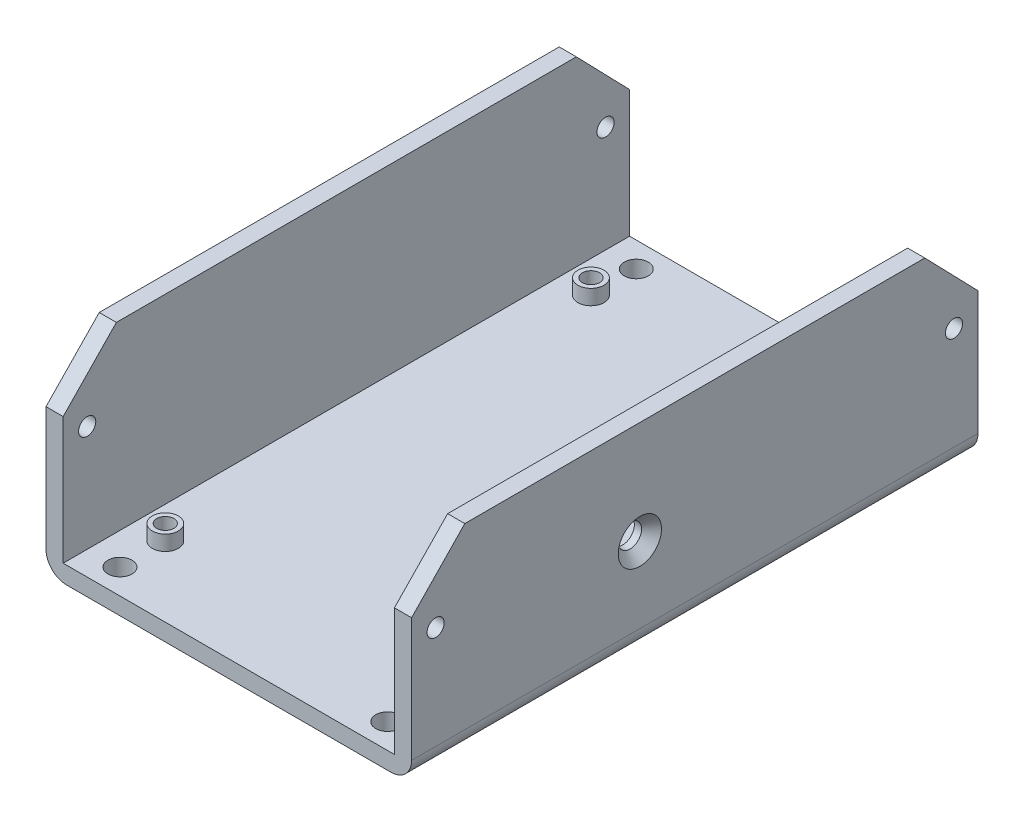
ISO-10303-21;
HEADER;
FILE_DESCRIPTION(('STEP AP214'),'2;1');
FILE_NAME('part.step','',(''),(''),'','','');
FILE_SCHEMA(('AUTOMOTIVE_DESIGN { 1 0 10303 214 1 1 1 1 }'));
ENDSEC;
DATA;
#1=APPLICATION_CONTEXT('core data for automotive mechanical design processes');
#2=APPLICATION_PROTOCOL_DEFINITION('international standard','automotive_design',2000,#1);
#3=PRODUCT_CONTEXT('',#1,'mechanical');
#4=PRODUCT('Part','Part','',(#3));
#5=PRODUCT_RELATED_PRODUCT_CATEGORY('part','',(#4));
#6=PRODUCT_DEFINITION_FORMATION('','',#4);
#7=PRODUCT_DEFINITION_CONTEXT('part definition',#1,'design');
#8=PRODUCT_DEFINITION('design','',#6,#7);
#9=PRODUCT_DEFINITION_SHAPE('','',#8);
#10=(LENGTH_UNIT() NAMED_UNIT(*) SI_UNIT(.MILLI.,.METRE.));
#11=(NAMED_UNIT(*) PLANE_ANGLE_UNIT() SI_UNIT($,.RADIAN.));
#12=(NAMED_UNIT(*) SI_UNIT($,.STERADIAN.) SOLID_ANGLE_UNIT());
#13=UNCERTAINTY_MEASURE_WITH_UNIT(LENGTH_MEASURE(1.E-05),#10,'distance_accuracy_value','');
#14=(GEOMETRIC_REPRESENTATION_CONTEXT(3) GLOBAL_UNCERTAINTY_ASSIGNED_CONTEXT((#13)) GLOBAL_UNIT_ASSIGNED_CONTEXT((#10,
#11,#12)) REPRESENTATION_CONTEXT('',''));
#15=CARTESIAN_POINT('',(0.,0.,0.));
#16=DIRECTION('',(0.,0.,1.));
#17=DIRECTION('',(1.,0.,0.));
#18=AXIS2_PLACEMENT_3D('',#15,#16,#17);
#19=CARTESIAN_POINT('',(-24.125,2.49999999999999,41.25));
#20=DIRECTION('',(-1.,0.,0.));
#21=DIRECTION('',(0.,0.,1.));
#22=AXIS2_PLACEMENT_3D('',#19,#20,#21);
#23=PLANE('',#22);
#24=CARTESIAN_POINT('',(-24.125,18.,-37.75));
#25=DIRECTION('',(-1.,0.,0.));
#26=DIRECTION('',(0.,0.,1.));
#27=AXIS2_PLACEMENT_3D('',#24,#25,#26);
#28=CIRCLE('',#27,1.24999999999999);
#29=CARTESIAN_POINT('',(-24.125,18.,-36.5));
#30=VERTEX_POINT('',#29);
#31=EDGE_CURVE('E362',#30,#30,#28,.F.);
#32=ORIENTED_EDGE('',*,*,#31,.F.);
#33=EDGE_LOOP('',(#32));
#34=FACE_BOUND('',#33,.T.);
#35=DIRECTION('',(0.,1.,0.));
#36=VECTOR('',#35,1.);
#37=CARTESIAN_POINT('',(-24.125,2.49999999999999,-41.25));
#38=LINE('',#37,#36);
#39=CARTESIAN_POINT('',(-24.125,2.49999999999999,-41.25));
#40=VERTEX_POINT('',#39);
#41=CARTESIAN_POINT('',(-24.125,21.,-41.25));
#42=VERTEX_POINT('',#41);
#43=EDGE_CURVE('E257',#40,#42,#38,.T.);
#44=ORIENTED_EDGE('',*,*,#43,.T.);
#45=DIRECTION('',(0.,0.718240222789173,0.695795215827013));
#46=VECTOR('',#45,1.);
#47=CARTESIAN_POINT('',(-24.125,52.6856423173804,-10.5545340050377));
#48=LINE('',#47,#46);
#49=CARTESIAN_POINT('',(-24.125,29.,-33.5));
#50=VERTEX_POINT('',#49);
#51=EDGE_CURVE('E325',#42,#50,#48,.T.);
#52=ORIENTED_EDGE('',*,*,#51,.T.);
#53=DIRECTION('',(0.,0.,-1.));
#54=VECTOR('',#53,1.);
#55=CARTESIAN_POINT('',(-24.125,29.,41.25));
#56=LINE('',#55,#54);
#57=CARTESIAN_POINT('',(-24.125,29.,33.5));
#58=VERTEX_POINT('',#57);
#59=EDGE_CURVE('E267',#58,#50,#56,.T.);
#60=ORIENTED_EDGE('',*,*,#59,.F.);
#61=DIRECTION('',(0.,-0.718240222789173,0.695795215827013));
#62=VECTOR('',#61,1.);
#63=CARTESIAN_POINT('',(-24.125,11.4564231738035,50.4953400503778));
#64=LINE('',#63,#62);
#65=CARTESIAN_POINT('',(-24.125,21.,41.25));
#66=VERTEX_POINT('',#65);
#67=EDGE_CURVE('E322',#58,#66,#64,.T.);
#68=ORIENTED_EDGE('',*,*,#67,.T.);
#69=DIRECTION('',(0.,1.,0.));
#70=VECTOR('',#69,1.);
#71=CARTESIAN_POINT('',(-24.125,2.49999999999999,41.25));
#72=LINE('',#71,#70);
#73=CARTESIAN_POINT('',(-24.125,2.49999999999999,41.25));
#74=VERTEX_POINT('',#73);
#75=EDGE_CURVE('E266',#74,#66,#72,.T.);
#76=ORIENTED_EDGE('',*,*,#75,.F.);
#77=DIRECTION('',(0.,0.,-1.));
#78=VECTOR('',#77,1.);
#79=CARTESIAN_POINT('',(-24.125,2.49999999999999,41.25));
#80=LINE('',#79,#78);
#81=EDGE_CURVE('E251',#74,#40,#80,.T.);
#82=ORIENTED_EDGE('',*,*,#81,.T.);
#83=EDGE_LOOP('',(#44,#52,#60,#68,#76,#82));
#84=FACE_BOUND('',#83,.T.);
#85=CARTESIAN_POINT('',(-24.125,18.,37.75));
#86=DIRECTION('',(-1.,0.,0.));
#87=DIRECTION('',(0.,0.,1.));
#88=AXIS2_PLACEMENT_3D('',#85,#86,#87);
#89=CIRCLE('',#88,1.24999999999999);
#90=CARTESIAN_POINT('',(-24.125,18.,39.));
#91=VERTEX_POINT('',#90);
#92=EDGE_CURVE('E356',#91,#91,#89,.F.);
#93=ORIENTED_EDGE('',*,*,#92,.F.);
#94=EDGE_LOOP('',(#93));
#95=FACE_BOUND('',#94,.T.);
#96=ADVANCED_FACE('F49',(#34,#84,#95),#23,.F.);
#97=CARTESIAN_POINT('',(24.125,29.,41.25));
#98=DIRECTION('',(1.,0.,0.));
#99=DIRECTION('',(0.,0.,-1.));
#100=AXIS2_PLACEMENT_3D('',#97,#98,#99);
#101=PLANE('',#100);
#102=CARTESIAN_POINT('',(24.125,14.,8.));
#103=DIRECTION('',(1.,0.,0.));
#104=DIRECTION('',(0.,0.,-1.));
#105=AXIS2_PLACEMENT_3D('',#102,#103,#104);
#106=CIRCLE('',#105,1.69999999999999);
#107=CARTESIAN_POINT('',(24.125,14.,6.30000000000001));
#108=VERTEX_POINT('',#107);
#109=EDGE_CURVE('E53',#108,#108,#106,.T.);
#110=ORIENTED_EDGE('',*,*,#109,.T.);
#111=EDGE_LOOP('',(#110));
#112=FACE_BOUND('',#111,.T.);
#113=DIRECTION('',(0.,0.,-1.));
#114=VECTOR('',#113,1.);
#115=CARTESIAN_POINT('',(24.125,29.,41.25));
#116=LINE('',#115,#114);
#117=CARTESIAN_POINT('',(24.125,29.,33.5));
#118=VERTEX_POINT('',#117);
#119=CARTESIAN_POINT('',(24.125,29.,-33.5));
#120=VERTEX_POINT('',#119);
#121=EDGE_CURVE('E179',#118,#120,#116,.T.);
#122=ORIENTED_EDGE('',*,*,#121,.T.);
#123=DIRECTION('',(0.,-0.718240222789173,-0.695795215827013));
#124=VECTOR('',#123,1.);
#125=CARTESIAN_POINT('',(24.125,66.3561712846348,2.68879093198998));
#126=LINE('',#125,#124);
#127=CARTESIAN_POINT('',(24.125,21.,-41.25));
#128=VERTEX_POINT('',#127);
#129=EDGE_CURVE('E156',#120,#128,#126,.T.);
#130=ORIENTED_EDGE('',*,*,#129,.T.);
#131=DIRECTION('',(0.,-1.,0.));
#132=VECTOR('',#131,1.);
#133=CARTESIAN_POINT('',(24.125,29.,-41.25));
#134=LINE('',#133,#132);
#135=CARTESIAN_POINT('',(24.125,2.49999999999999,-41.25));
#136=VERTEX_POINT('',#135);
#137=EDGE_CURVE('E258',#128,#136,#134,.T.);
#138=ORIENTED_EDGE('',*,*,#137,.T.);
#139=DIRECTION('',(0.,0.,-1.));
#140=VECTOR('',#139,1.);
#141=CARTESIAN_POINT('',(24.125,2.49999999999999,41.25));
#142=LINE('',#141,#140);
#143=CARTESIAN_POINT('',(24.125,2.49999999999999,41.25));
#144=VERTEX_POINT('',#143);
#145=EDGE_CURVE('E183',#144,#136,#142,.T.);
#146=ORIENTED_EDGE('',*,*,#145,.F.);
#147=DIRECTION('',(0.,-1.,0.));
#148=VECTOR('',#147,1.);
#149=CARTESIAN_POINT('',(24.125,29.,41.25));
#150=LINE('',#149,#148);
#151=CARTESIAN_POINT('',(24.125,21.,41.25));
#152=VERTEX_POINT('',#151);
#153=EDGE_CURVE('E287',#152,#144,#150,.T.);
#154=ORIENTED_EDGE('',*,*,#153,.F.);
#155=DIRECTION('',(0.,0.718240222789173,-0.695795215827013));
#156=VECTOR('',#155,1.);
#157=CARTESIAN_POINT('',(24.125,25.1269521410579,37.2520151133501));
#158=LINE('',#157,#156);
#159=EDGE_CURVE('E65',#152,#118,#158,.T.);
#160=ORIENTED_EDGE('',*,*,#159,.T.);
#161=EDGE_LOOP('',(#122,#130,#138,#146,#154,#160));
#162=FACE_BOUND('',#161,.T.);
#163=CARTESIAN_POINT('',(24.125,18.,37.75));
#164=DIRECTION('',(1.,0.,0.));
#165=DIRECTION('',(0.,0.,-1.));
#166=AXIS2_PLACEMENT_3D('',#163,#164,#165);
#167=CIRCLE('',#166,1.24999999999999);
#168=CARTESIAN_POINT('',(24.125,18.,36.5));
#169=VERTEX_POINT('',#168);
#170=EDGE_CURVE('E342',#169,#169,#167,.F.);
#171=ORIENTED_EDGE('',*,*,#170,.F.);
#172=EDGE_LOOP('',(#171));
#173=FACE_BOUND('',#172,.T.);
#174=CARTESIAN_POINT('',(24.125,18.,-37.75));
#175=DIRECTION('',(1.,0.,0.));
#176=DIRECTION('',(0.,0.,-1.));
#177=AXIS2_PLACEMENT_3D('',#174,#175,#176);
#178=CIRCLE('',#177,1.24999999999999);
#179=CARTESIAN_POINT('',(24.125,18.,-39.));
#180=VERTEX_POINT('',#179);
#181=EDGE_CURVE('E350',#180,#180,#178,.F.);
#182=ORIENTED_EDGE('',*,*,#181,.F.);
#183=EDGE_LOOP('',(#182));
#184=FACE_BOUND('',#183,.T.);
#185=ADVANCED_FACE('F300',(#112,#162,#173,#184),#101,.F.);
#186=CARTESIAN_POINT('',(-24.125,29.,41.25));
#187=DIRECTION('',(0.,-1.,0.));
#188=DIRECTION('',(1.,0.,0.));
#189=AXIS2_PLACEMENT_3D('',#186,#187,#188);
#190=PLANE('',#189);
#191=ORIENTED_EDGE('',*,*,#59,.T.);
#192=DIRECTION('',(1.,0.,0.));
#193=VECTOR('',#192,1.);
#194=CARTESIAN_POINT('',(-26.625,29.,-33.5));
#195=LINE('',#194,#193);
#196=CARTESIAN_POINT('',(-26.625,29.,-33.5));
#197=VERTEX_POINT('',#196);
#198=EDGE_CURVE('E161',#197,#50,#195,.T.);
#199=ORIENTED_EDGE('',*,*,#198,.F.);
#200=DIRECTION('',(0.,0.,-1.));
#201=VECTOR('',#200,1.);
#202=CARTESIAN_POINT('',(-26.625,29.,41.25));
#203=LINE('',#202,#201);
#204=CARTESIAN_POINT('',(-26.625,29.,33.5));
#205=VERTEX_POINT('',#204);
#206=EDGE_CURVE('E195',#205,#197,#203,.T.);
#207=ORIENTED_EDGE('',*,*,#206,.F.);
#208=DIRECTION('',(1.,0.,0.));
#209=VECTOR('',#208,1.);
#210=CARTESIAN_POINT('',(-26.625,29.,33.5));
#211=LINE('',#210,#209);
#212=EDGE_CURVE('E173',#205,#58,#211,.T.);
#213=ORIENTED_EDGE('',*,*,#212,.T.);
#214=EDGE_LOOP('',(#191,#199,#207,#213));
#215=FACE_BOUND('',#214,.T.);
#216=ADVANCED_FACE('F51',(#215),#190,.F.);
#217=CARTESIAN_POINT('',(-26.625,29.,41.25));
#218=DIRECTION('',(1.,0.,0.));
#219=DIRECTION('',(0.,1.,0.));
#220=AXIS2_PLACEMENT_3D('',#217,#218,#219);
#221=PLANE('',#220);
#222=CARTESIAN_POINT('',(-26.625,18.,-37.75));
#223=DIRECTION('',(-1.,0.,0.));
#224=DIRECTION('',(0.,0.,1.));
#225=AXIS2_PLACEMENT_3D('',#222,#223,#224);
#226=CIRCLE('',#225,1.24999999999999);
#227=CARTESIAN_POINT('',(-26.625,18.,-36.5));
#228=VERTEX_POINT('',#227);
#229=EDGE_CURVE('E365',#228,#228,#226,.T.);
#230=ORIENTED_EDGE('',*,*,#229,.F.);
#231=EDGE_LOOP('',(#230));
#232=FACE_BOUND('',#231,.T.);
#233=CARTESIAN_POINT('',(-26.625,18.,37.75));
#234=DIRECTION('',(-1.,0.,0.));
#235=DIRECTION('',(0.,0.,1.));
#236=AXIS2_PLACEMENT_3D('',#233,#234,#235);
#237=CIRCLE('',#236,1.24999999999999);
#238=CARTESIAN_POINT('',(-26.625,18.,39.));
#239=VERTEX_POINT('',#238);
#240=EDGE_CURVE('E359',#239,#239,#237,.T.);
#241=ORIENTED_EDGE('',*,*,#240,.F.);
#242=EDGE_LOOP('',(#241));
#243=FACE_BOUND('',#242,.T.);
#244=ORIENTED_EDGE('',*,*,#206,.T.);
#245=DIRECTION('',(0.,-0.718240222789173,-0.695795215827013));
#246=VECTOR('',#245,1.);
#247=CARTESIAN_POINT('',(-26.625,29.,-33.5));
#248=LINE('',#247,#246);
#249=CARTESIAN_POINT('',(-26.625,21.,-41.25));
#250=VERTEX_POINT('',#249);
#251=EDGE_CURVE('E162',#197,#250,#248,.T.);
#252=ORIENTED_EDGE('',*,*,#251,.T.);
#253=DIRECTION('',(0.,-1.,0.));
#254=VECTOR('',#253,1.);
#255=CARTESIAN_POINT('',(-26.625,29.,-41.25));
#256=LINE('',#255,#254);
#257=CARTESIAN_POINT('',(-26.625,3.,-41.25));
#258=VERTEX_POINT('',#257);
#259=EDGE_CURVE('E291',#250,#258,#256,.T.);
#260=ORIENTED_EDGE('',*,*,#259,.T.);
#261=DIRECTION('',(0.,0.,-1.));
#262=VECTOR('',#261,1.);
#263=CARTESIAN_POINT('',(-26.625,3.,41.25));
#264=LINE('',#263,#262);
#265=CARTESIAN_POINT('',(-26.625,3.,41.25));
#266=VERTEX_POINT('',#265);
#267=EDGE_CURVE('E192',#266,#258,#264,.T.);
#268=ORIENTED_EDGE('',*,*,#267,.F.);
#269=DIRECTION('',(0.,-1.,0.));
#270=VECTOR('',#269,1.);
#271=CARTESIAN_POINT('',(-26.625,29.,41.25));
#272=LINE('',#271,#270);
#273=CARTESIAN_POINT('',(-26.625,21.,41.25));
#274=VERTEX_POINT('',#273);
#275=EDGE_CURVE('E273',#274,#266,#272,.T.);
#276=ORIENTED_EDGE('',*,*,#275,.F.);
#277=DIRECTION('',(0.,0.718240222789173,-0.695795215827013));
#278=VECTOR('',#277,1.);
#279=CARTESIAN_POINT('',(-26.625,21.,41.25));
#280=LINE('',#279,#278);
#281=EDGE_CURVE('E73',#274,#205,#280,.T.);
#282=ORIENTED_EDGE('',*,*,#281,.T.);
#283=EDGE_LOOP('',(#244,#252,#260,#268,#276,#282));
#284=FACE_BOUND('',#283,.T.);
#285=ADVANCED_FACE('F462',(#232,#243,#284),#221,.F.);
#286=CARTESIAN_POINT('',(-23.625,3.,41.25));
#287=DIRECTION('',(0.,0.,-1.));
#288=DIRECTION('',(-1.,0.,0.));
#289=AXIS2_PLACEMENT_3D('',#286,#287,#288);
#290=CYLINDRICAL_SURFACE('',#289,3.);
#291=CARTESIAN_POINT('',(-23.625,3.,-41.25));
#292=DIRECTION('',(0.,0.,1.));
#293=DIRECTION('',(1.,0.,0.));
#294=AXIS2_PLACEMENT_3D('',#291,#292,#293);
#295=CIRCLE('',#294,3.);
#296=CARTESIAN_POINT('',(-23.625,0.,-41.25));
#297=VERTEX_POINT('',#296);
#298=EDGE_CURVE('E293',#258,#297,#295,.T.);
#299=ORIENTED_EDGE('',*,*,#298,.T.);
#300=DIRECTION('',(0.,0.,-1.));
#301=VECTOR('',#300,1.);
#302=CARTESIAN_POINT('',(-23.625,0.,41.25));
#303=LINE('',#302,#301);
#304=CARTESIAN_POINT('',(-23.625,0.,41.25));
#305=VERTEX_POINT('',#304);
#306=EDGE_CURVE('E189',#305,#297,#303,.T.);
#307=ORIENTED_EDGE('',*,*,#306,.F.);
#308=CARTESIAN_POINT('',(-23.625,3.,41.25));
#309=DIRECTION('',(0.,0.,1.));
#310=DIRECTION('',(1.,0.,0.));
#311=AXIS2_PLACEMENT_3D('',#308,#309,#310);
#312=CIRCLE('',#311,3.);
#313=EDGE_CURVE('E275',#266,#305,#312,.T.);
#314=ORIENTED_EDGE('',*,*,#313,.F.);
#315=ORIENTED_EDGE('',*,*,#267,.T.);
#316=EDGE_LOOP('',(#299,#307,#314,#315));
#317=FACE_BOUND('',#316,.T.);
#318=ADVANCED_FACE('F459',(#317),#290,.T.);
#319=CARTESIAN_POINT('',(-23.625,0.,41.25));
#320=DIRECTION('',(0.,1.,0.));
#321=DIRECTION('',(-1.,0.,0.));
#322=AXIS2_PLACEMENT_3D('',#319,#320,#321);
#323=PLANE('',#322);
#324=CARTESIAN_POINT('',(19.5,0.,-31.));
#325=DIRECTION('',(0.,1.,0.));
#326=DIRECTION('',(0.,0.,1.));
#327=AXIS2_PLACEMENT_3D('',#324,#325,#326);
#328=CIRCLE('',#327,1.24999999999999);
#329=CARTESIAN_POINT('',(19.5,0.,-29.75));
#330=VERTEX_POINT('',#329);
#331=EDGE_CURVE('E400',#330,#330,#328,.T.);
#332=ORIENTED_EDGE('',*,*,#331,.T.);
#333=EDGE_LOOP('',(#332));
#334=FACE_BOUND('',#333,.T.);
#335=CARTESIAN_POINT('',(-19.5,0.,-31.));
#336=DIRECTION('',(0.,1.,0.));
#337=DIRECTION('',(0.,0.,1.));
#338=AXIS2_PLACEMENT_3D('',#335,#336,#337);
#339=CIRCLE('',#338,1.24999999999999);
#340=CARTESIAN_POINT('',(-19.5,0.,-29.75));
#341=VERTEX_POINT('',#340);
#342=EDGE_CURVE('E394',#341,#341,#339,.T.);
#343=ORIENTED_EDGE('',*,*,#342,.T.);
#344=EDGE_LOOP('',(#343));
#345=FACE_BOUND('',#344,.T.);
#346=CARTESIAN_POINT('',(19.5,0.,31.));
#347=DIRECTION('',(0.,1.,0.));
#348=DIRECTION('',(0.,0.,1.));
#349=AXIS2_PLACEMENT_3D('',#346,#347,#348);
#350=CIRCLE('',#349,1.24999999999999);
#351=CARTESIAN_POINT('',(19.5,0.,32.25));
#352=VERTEX_POINT('',#351);
#353=EDGE_CURVE('E388',#352,#352,#350,.T.);
#354=ORIENTED_EDGE('',*,*,#353,.T.);
#355=EDGE_LOOP('',(#354));
#356=FACE_BOUND('',#355,.T.);
#357=CARTESIAN_POINT('',(-19.5,0.,31.));
#358=DIRECTION('',(0.,1.,0.));
#359=DIRECTION('',(0.,0.,1.));
#360=AXIS2_PLACEMENT_3D('',#357,#358,#359);
#361=CIRCLE('',#360,1.24999999999999);
#362=CARTESIAN_POINT('',(-19.5,0.,32.25));
#363=VERTEX_POINT('',#362);
#364=EDGE_CURVE('E382',#363,#363,#361,.T.);
#365=ORIENTED_EDGE('',*,*,#364,.T.);
#366=EDGE_LOOP('',(#365));
#367=FACE_BOUND('',#366,.T.);
#368=CARTESIAN_POINT('',(19.5,0.,-37.6));
#369=DIRECTION('',(0.,-1.,0.));
#370=DIRECTION('',(1.,0.,0.));
#371=AXIS2_PLACEMENT_3D('',#368,#369,#370);
#372=CIRCLE('',#371,1.75);
#373=CARTESIAN_POINT('',(21.25,0.,-37.6));
#374=VERTEX_POINT('',#373);
#375=EDGE_CURVE('E338',#374,#374,#372,.T.);
#376=ORIENTED_EDGE('',*,*,#375,.F.);
#377=EDGE_LOOP('',(#376));
#378=FACE_BOUND('',#377,.T.);
#379=CARTESIAN_POINT('',(19.5,0.,37.6));
#380=DIRECTION('',(0.,-1.,0.));
#381=DIRECTION('',(1.,0.,0.));
#382=AXIS2_PLACEMENT_3D('',#379,#380,#381);
#383=CIRCLE('',#382,1.75);
#384=CARTESIAN_POINT('',(21.25,0.,37.6));
#385=VERTEX_POINT('',#384);
#386=EDGE_CURVE('E341',#385,#385,#383,.T.);
#387=ORIENTED_EDGE('',*,*,#386,.F.);
#388=EDGE_LOOP('',(#387));
#389=FACE_BOUND('',#388,.T.);
#390=CARTESIAN_POINT('',(-19.5,0.,37.6));
#391=DIRECTION('',(0.,-1.,0.));
#392=DIRECTION('',(1.,0.,0.));
#393=AXIS2_PLACEMENT_3D('',#390,#391,#392);
#394=CIRCLE('',#393,1.75);
#395=CARTESIAN_POINT('',(-17.75,0.,37.6));
#396=VERTEX_POINT('',#395);
#397=EDGE_CURVE('E337',#396,#396,#394,.T.);
#398=ORIENTED_EDGE('',*,*,#397,.F.);
#399=EDGE_LOOP('',(#398));
#400=FACE_BOUND('',#399,.T.);
#401=CARTESIAN_POINT('',(-19.5,0.,-37.6));
#402=DIRECTION('',(0.,-1.,0.));
#403=DIRECTION('',(1.,0.,0.));
#404=AXIS2_PLACEMENT_3D('',#401,#402,#403);
#405=CIRCLE('',#404,1.75);
#406=CARTESIAN_POINT('',(-17.75,0.,-37.6));
#407=VERTEX_POINT('',#406);
#408=EDGE_CURVE('E207',#407,#407,#405,.T.);
#409=ORIENTED_EDGE('',*,*,#408,.F.);
#410=EDGE_LOOP('',(#409));
#411=FACE_BOUND('',#410,.T.);
#412=DIRECTION('',(1.,0.,0.));
#413=VECTOR('',#412,1.);
#414=CARTESIAN_POINT('',(-23.625,0.,-41.25));
#415=LINE('',#414,#413);
#416=CARTESIAN_POINT('',(23.625,0.,-41.25));
#417=VERTEX_POINT('',#416);
#418=EDGE_CURVE('E295',#297,#417,#415,.T.);
#419=ORIENTED_EDGE('',*,*,#418,.T.);
#420=DIRECTION('',(0.,0.,-1.));
#421=VECTOR('',#420,1.);
#422=CARTESIAN_POINT('',(23.625,0.,41.25));
#423=LINE('',#422,#421);
#424=CARTESIAN_POINT('',(23.625,0.,41.25));
#425=VERTEX_POINT('',#424);
#426=EDGE_CURVE('E181',#425,#417,#423,.T.);
#427=ORIENTED_EDGE('',*,*,#426,.F.);
#428=DIRECTION('',(1.,0.,0.));
#429=VECTOR('',#428,1.);
#430=CARTESIAN_POINT('',(-23.625,0.,41.25));
#431=LINE('',#430,#429);
#432=EDGE_CURVE('E316',#305,#425,#431,.T.);
#433=ORIENTED_EDGE('',*,*,#432,.F.);
#434=ORIENTED_EDGE('',*,*,#306,.T.);
#435=EDGE_LOOP('',(#419,#427,#433,#434));
#436=FACE_BOUND('',#435,.T.);
#437=ADVANCED_FACE('F456',(#334,#345,#356,#367,#378,#389,#400,#411,#436),#323,.F.);
#438=CARTESIAN_POINT('',(23.625,3.,41.25));
#439=DIRECTION('',(0.,0.,-1.));
#440=DIRECTION('',(-1.,0.,0.));
#441=AXIS2_PLACEMENT_3D('',#438,#439,#440);
#442=CYLINDRICAL_SURFACE('',#441,3.);
#443=CARTESIAN_POINT('',(23.625,3.,-41.25));
#444=DIRECTION('',(0.,0.,1.));
#445=DIRECTION('',(1.,0.,0.));
#446=AXIS2_PLACEMENT_3D('',#443,#444,#445);
#447=CIRCLE('',#446,3.);
#448=CARTESIAN_POINT('',(26.625,3.,-41.25));
#449=VERTEX_POINT('',#448);
#450=EDGE_CURVE('E297',#417,#449,#447,.T.);
#451=ORIENTED_EDGE('',*,*,#450,.T.);
#452=DIRECTION('',(0.,0.,-1.));
#453=VECTOR('',#452,1.);
#454=CARTESIAN_POINT('',(26.625,3.,41.25));
#455=LINE('',#454,#453);
#456=CARTESIAN_POINT('',(26.625,3.,41.25));
#457=VERTEX_POINT('',#456);
#458=EDGE_CURVE('E178',#457,#449,#455,.T.);
#459=ORIENTED_EDGE('',*,*,#458,.F.);
#460=CARTESIAN_POINT('',(23.625,3.,41.25));
#461=DIRECTION('',(0.,0.,1.));
#462=DIRECTION('',(1.,0.,0.));
#463=AXIS2_PLACEMENT_3D('',#460,#461,#462);
#464=CIRCLE('',#463,3.);
#465=EDGE_CURVE('E314',#425,#457,#464,.T.);
#466=ORIENTED_EDGE('',*,*,#465,.F.);
#467=ORIENTED_EDGE('',*,*,#426,.T.);
#468=EDGE_LOOP('',(#451,#459,#466,#467));
#469=FACE_BOUND('',#468,.T.);
#470=ADVANCED_FACE('F308',(#469),#442,.T.);
#471=CARTESIAN_POINT('',(26.625,3.,41.25));
#472=DIRECTION('',(-1.,0.,0.));
#473=DIRECTION('',(0.,-1.,0.));
#474=AXIS2_PLACEMENT_3D('',#471,#472,#473);
#475=PLANE('',#474);
#476=CARTESIAN_POINT('',(26.625,14.,8.));
#477=DIRECTION('',(1.,0.,0.));
#478=DIRECTION('',(0.,0.,-1.));
#479=AXIS2_PLACEMENT_3D('',#476,#477,#478);
#480=CIRCLE('',#479,3.15);
#481=CARTESIAN_POINT('',(26.625,14.,4.85));
#482=VERTEX_POINT('',#481);
#483=EDGE_CURVE('E409',#482,#482,#480,.T.);
#484=ORIENTED_EDGE('',*,*,#483,.F.);
#485=EDGE_LOOP('',(#484));
#486=FACE_BOUND('',#485,.T.);
#487=CARTESIAN_POINT('',(26.625,18.,-37.75));
#488=DIRECTION('',(1.,0.,0.));
#489=DIRECTION('',(0.,0.,-1.));
#490=AXIS2_PLACEMENT_3D('',#487,#488,#489);
#491=CIRCLE('',#490,1.24999999999999);
#492=CARTESIAN_POINT('',(26.625,18.,-39.));
#493=VERTEX_POINT('',#492);
#494=EDGE_CURVE('E353',#493,#493,#491,.T.);
#495=ORIENTED_EDGE('',*,*,#494,.F.);
#496=EDGE_LOOP('',(#495));
#497=FACE_BOUND('',#496,.T.);
#498=CARTESIAN_POINT('',(26.625,18.,37.75));
#499=DIRECTION('',(1.,0.,0.));
#500=DIRECTION('',(0.,0.,-1.));
#501=AXIS2_PLACEMENT_3D('',#498,#499,#500);
#502=CIRCLE('',#501,1.24999999999999);
#503=CARTESIAN_POINT('',(26.625,18.,36.5));
#504=VERTEX_POINT('',#503);
#505=EDGE_CURVE('E347',#504,#504,#502,.T.);
#506=ORIENTED_EDGE('',*,*,#505,.F.);
#507=EDGE_LOOP('',(#506));
#508=FACE_BOUND('',#507,.T.);
#509=DIRECTION('',(0.,1.,0.));
#510=VECTOR('',#509,1.);
#511=CARTESIAN_POINT('',(26.625,3.,-41.25));
#512=LINE('',#511,#510);
#513=CARTESIAN_POINT('',(26.625,21.,-41.25));
#514=VERTEX_POINT('',#513);
#515=EDGE_CURVE('E172',#449,#514,#512,.T.);
#516=ORIENTED_EDGE('',*,*,#515,.T.);
#517=DIRECTION('',(0.,-0.718240222789173,-0.695795215827013));
#518=VECTOR('',#517,1.);
#519=CARTESIAN_POINT('',(26.625,29.,-33.5));
#520=LINE('',#519,#518);
#521=CARTESIAN_POINT('',(26.625,29.,-33.5));
#522=VERTEX_POINT('',#521);
#523=EDGE_CURVE('E153',#522,#514,#520,.T.);
#524=ORIENTED_EDGE('',*,*,#523,.F.);
#525=DIRECTION('',(0.,0.,-1.));
#526=VECTOR('',#525,1.);
#527=CARTESIAN_POINT('',(26.625,29.,41.25));
#528=LINE('',#527,#526);
#529=CARTESIAN_POINT('',(26.625,29.,33.5));
#530=VERTEX_POINT('',#529);
#531=EDGE_CURVE('E169',#530,#522,#528,.T.);
#532=ORIENTED_EDGE('',*,*,#531,.F.);
#533=DIRECTION('',(0.,0.718240222789173,-0.695795215827013));
#534=VECTOR('',#533,1.);
#535=CARTESIAN_POINT('',(26.625,21.,41.25));
#536=LINE('',#535,#534);
#537=CARTESIAN_POINT('',(26.625,21.,41.25));
#538=VERTEX_POINT('',#537);
#539=EDGE_CURVE('E216',#538,#530,#536,.T.);
#540=ORIENTED_EDGE('',*,*,#539,.F.);
#541=DIRECTION('',(0.,1.,0.));
#542=VECTOR('',#541,1.);
#543=CARTESIAN_POINT('',(26.625,3.,41.25));
#544=LINE('',#543,#542);
#545=EDGE_CURVE('E313',#457,#538,#544,.T.);
#546=ORIENTED_EDGE('',*,*,#545,.F.);
#547=ORIENTED_EDGE('',*,*,#458,.T.);
#548=EDGE_LOOP('',(#516,#524,#532,#540,#546,#547));
#549=FACE_BOUND('',#548,.T.);
#550=ADVANCED_FACE('F167',(#486,#497,#508,#549),#475,.F.);
#551=CARTESIAN_POINT('',(26.625,29.,41.25));
#552=DIRECTION('',(0.,-1.,0.));
#553=DIRECTION('',(1.,0.,0.));
#554=AXIS2_PLACEMENT_3D('',#551,#552,#553);
#555=PLANE('',#554);
#556=ORIENTED_EDGE('',*,*,#531,.T.);
#557=EDGE_CURVE('E150',#120,#522,#195,.T.);
#558=ORIENTED_EDGE('',*,*,#557,.F.);
#559=ORIENTED_EDGE('',*,*,#121,.F.);
#560=EDGE_CURVE('E177',#118,#530,#211,.T.);
#561=ORIENTED_EDGE('',*,*,#560,.T.);
#562=EDGE_LOOP('',(#556,#558,#559,#561));
#563=FACE_BOUND('',#562,.T.);
#564=ADVANCED_FACE('F176',(#563),#555,.F.);
#565=CARTESIAN_POINT('',(24.125,2.49999999999999,41.25));
#566=DIRECTION('',(0.,-1.,0.));
#567=DIRECTION('',(0.,0.,-1.));
#568=AXIS2_PLACEMENT_3D('',#565,#566,#567);
#569=PLANE('',#568);
#570=CARTESIAN_POINT('',(-19.5,2.49999999999999,-31.));
#571=DIRECTION('',(0.,-1.,0.));
#572=DIRECTION('',(0.,0.,-1.));
#573=AXIS2_PLACEMENT_3D('',#570,#571,#572);
#574=CIRCLE('',#573,1.9);
#575=CARTESIAN_POINT('',(-19.5,2.49999999999999,-32.9));
#576=VERTEX_POINT('',#575);
#577=EDGE_CURVE('E13',#576,#576,#574,.F.);
#578=ORIENTED_EDGE('',*,*,#577,.F.);
#579=EDGE_LOOP('',(#578));
#580=FACE_BOUND('',#579,.T.);
#581=CARTESIAN_POINT('',(-19.5,2.49999999999999,31.));
#582=DIRECTION('',(0.,-1.,0.));
#583=DIRECTION('',(0.,0.,-1.));
#584=AXIS2_PLACEMENT_3D('',#581,#582,#583);
#585=CIRCLE('',#584,1.9);
#586=CARTESIAN_POINT('',(-19.5,2.49999999999999,29.1));
#587=VERTEX_POINT('',#586);
#588=EDGE_CURVE('E58',#587,#587,#585,.F.);
#589=ORIENTED_EDGE('',*,*,#588,.F.);
#590=EDGE_LOOP('',(#589));
#591=FACE_BOUND('',#590,.T.);
#592=CARTESIAN_POINT('',(19.5,2.49999999999999,31.));
#593=DIRECTION('',(0.,-1.,0.));
#594=DIRECTION('',(0.,0.,-1.));
#595=AXIS2_PLACEMENT_3D('',#592,#593,#594);
#596=CIRCLE('',#595,1.9);
#597=CARTESIAN_POINT('',(19.5,2.49999999999999,29.1));
#598=VERTEX_POINT('',#597);
#599=EDGE_CURVE('E219',#598,#598,#596,.F.);
#600=ORIENTED_EDGE('',*,*,#599,.F.);
#601=EDGE_LOOP('',(#600));
#602=FACE_BOUND('',#601,.T.);
#603=CARTESIAN_POINT('',(19.5,2.49999999999999,-31.));
#604=DIRECTION('',(0.,-1.,0.));
#605=DIRECTION('',(0.,0.,-1.));
#606=AXIS2_PLACEMENT_3D('',#603,#604,#605);
#607=CIRCLE('',#606,1.9);
#608=CARTESIAN_POINT('',(19.5,2.49999999999999,-32.9));
#609=VERTEX_POINT('',#608);
#610=EDGE_CURVE('E202',#609,#609,#607,.F.);
#611=ORIENTED_EDGE('',*,*,#610,.F.);
#612=EDGE_LOOP('',(#611));
#613=FACE_BOUND('',#612,.T.);
#614=CARTESIAN_POINT('',(19.5,2.49999999999999,-37.6));
#615=DIRECTION('',(0.,-1.,0.));
#616=DIRECTION('',(0.,0.,-1.));
#617=AXIS2_PLACEMENT_3D('',#614,#615,#616);
#618=CIRCLE('',#617,1.75);
#619=CARTESIAN_POINT('',(19.5,2.49999999999999,-39.35));
#620=VERTEX_POINT('',#619);
#621=EDGE_CURVE('E213',#620,#620,#618,.T.);
#622=ORIENTED_EDGE('',*,*,#621,.T.);
#623=EDGE_LOOP('',(#622));
#624=FACE_BOUND('',#623,.T.);
#625=CARTESIAN_POINT('',(19.5,2.49999999999999,37.6));
#626=DIRECTION('',(0.,-1.,0.));
#627=DIRECTION('',(0.,0.,-1.));
#628=AXIS2_PLACEMENT_3D('',#625,#626,#627);
#629=CIRCLE('',#628,1.75);
#630=CARTESIAN_POINT('',(19.5,2.49999999999999,35.85));
#631=VERTEX_POINT('',#630);
#632=EDGE_CURVE('E210',#631,#631,#629,.T.);
#633=ORIENTED_EDGE('',*,*,#632,.T.);
#634=EDGE_LOOP('',(#633));
#635=FACE_BOUND('',#634,.T.);
#636=CARTESIAN_POINT('',(-19.5,2.49999999999999,37.6));
#637=DIRECTION('',(0.,-1.,0.));
#638=DIRECTION('',(0.,0.,-1.));
#639=AXIS2_PLACEMENT_3D('',#636,#637,#638);
#640=CIRCLE('',#639,1.75);
#641=CARTESIAN_POINT('',(-19.5,2.49999999999999,35.85));
#642=VERTEX_POINT('',#641);
#643=EDGE_CURVE('E206',#642,#642,#640,.T.);
#644=ORIENTED_EDGE('',*,*,#643,.T.);
#645=EDGE_LOOP('',(#644));
#646=FACE_BOUND('',#645,.T.);
#647=CARTESIAN_POINT('',(-19.5,2.49999999999999,-37.6));
#648=DIRECTION('',(0.,-1.,0.));
#649=DIRECTION('',(0.,0.,-1.));
#650=AXIS2_PLACEMENT_3D('',#647,#648,#649);
#651=CIRCLE('',#650,1.75);
#652=CARTESIAN_POINT('',(-19.5,2.49999999999999,-39.35));
#653=VERTEX_POINT('',#652);
#654=EDGE_CURVE('E203',#653,#653,#651,.T.);
#655=ORIENTED_EDGE('',*,*,#654,.T.);
#656=EDGE_LOOP('',(#655));
#657=FACE_BOUND('',#656,.T.);
#658=DIRECTION('',(-1.,0.,0.));
#659=VECTOR('',#658,1.);
#660=CARTESIAN_POINT('',(24.125,2.49999999999999,-41.25));
#661=LINE('',#660,#659);
#662=EDGE_CURVE('E248',#136,#40,#661,.T.);
#663=ORIENTED_EDGE('',*,*,#662,.T.);
#664=ORIENTED_EDGE('',*,*,#81,.F.);
#665=DIRECTION('',(-1.,0.,0.));
#666=VECTOR('',#665,1.);
#667=CARTESIAN_POINT('',(24.125,2.49999999999999,41.25));
#668=LINE('',#667,#666);
#669=EDGE_CURVE('E284',#144,#74,#668,.T.);
#670=ORIENTED_EDGE('',*,*,#669,.F.);
#671=ORIENTED_EDGE('',*,*,#145,.T.);
#672=EDGE_LOOP('',(#663,#664,#670,#671));
#673=FACE_BOUND('',#672,.T.);
#674=ADVANCED_FACE('F227',(#580,#591,#602,#613,#624,#635,#646,#657,#673),#569,.F.);
#675=CARTESIAN_POINT('',(-23.625,3.,41.25));
#676=DIRECTION('',(0.,0.,1.));
#677=DIRECTION('',(1.,0.,0.));
#678=AXIS2_PLACEMENT_3D('',#675,#676,#677);
#679=PLANE('',#678);
#680=DIRECTION('',(1.,0.,0.));
#681=VECTOR('',#680,1.);
#682=CARTESIAN_POINT('',(-26.625,21.,41.25));
#683=LINE('',#682,#681);
#684=EDGE_CURVE('E327',#274,#66,#683,.T.);
#685=ORIENTED_EDGE('',*,*,#684,.F.);
#686=ORIENTED_EDGE('',*,*,#275,.T.);
#687=ORIENTED_EDGE('',*,*,#313,.T.);
#688=ORIENTED_EDGE('',*,*,#432,.T.);
#689=ORIENTED_EDGE('',*,*,#465,.T.);
#690=ORIENTED_EDGE('',*,*,#545,.T.);
#691=DIRECTION('',(1.,0.,0.));
#692=VECTOR('',#691,1.);
#693=CARTESIAN_POINT('',(-23.625,21.,41.25));
#694=LINE('',#693,#692);
#695=EDGE_CURVE('E200',#152,#538,#694,.T.);
#696=ORIENTED_EDGE('',*,*,#695,.F.);
#697=ORIENTED_EDGE('',*,*,#153,.T.);
#698=ORIENTED_EDGE('',*,*,#669,.T.);
#699=ORIENTED_EDGE('',*,*,#75,.T.);
#700=EDGE_LOOP('',(#685,#686,#687,#688,#689,#690,#696,#697,#698,#699));
#701=FACE_BOUND('',#700,.T.);
#702=ADVANCED_FACE('F230',(#701),#679,.T.);
#703=CARTESIAN_POINT('',(-23.625,3.,-41.25));
#704=DIRECTION('',(0.,0.,1.));
#705=DIRECTION('',(1.,0.,0.));
#706=AXIS2_PLACEMENT_3D('',#703,#704,#705);
#707=PLANE('',#706);
#708=ORIENTED_EDGE('',*,*,#259,.F.);
#709=DIRECTION('',(1.,0.,0.));
#710=VECTOR('',#709,1.);
#711=CARTESIAN_POINT('',(-26.625,21.,-41.25));
#712=LINE('',#711,#710);
#713=EDGE_CURVE('E272',#250,#42,#712,.T.);
#714=ORIENTED_EDGE('',*,*,#713,.T.);
#715=ORIENTED_EDGE('',*,*,#43,.F.);
#716=ORIENTED_EDGE('',*,*,#662,.F.);
#717=ORIENTED_EDGE('',*,*,#137,.F.);
#718=DIRECTION('',(1.,0.,0.));
#719=VECTOR('',#718,1.);
#720=CARTESIAN_POINT('',(-23.625,21.,-41.25));
#721=LINE('',#720,#719);
#722=EDGE_CURVE('E198',#128,#514,#721,.T.);
#723=ORIENTED_EDGE('',*,*,#722,.T.);
#724=ORIENTED_EDGE('',*,*,#515,.F.);
#725=ORIENTED_EDGE('',*,*,#450,.F.);
#726=ORIENTED_EDGE('',*,*,#418,.F.);
#727=ORIENTED_EDGE('',*,*,#298,.F.);
#728=EDGE_LOOP('',(#708,#714,#715,#716,#717,#723,#724,#725,#726,#727));
#729=FACE_BOUND('',#728,.T.);
#730=ADVANCED_FACE('F271',(#729),#707,.F.);
#731=CARTESIAN_POINT('',(-26.625,29.,-33.5));
#732=DIRECTION('',(0.,-0.695795215827013,0.718240222789173));
#733=DIRECTION('',(0.,-0.718240222789173,-0.695795215827013));
#734=AXIS2_PLACEMENT_3D('',#731,#732,#733);
#735=PLANE('',#734);
#736=ORIENTED_EDGE('',*,*,#557,.T.);
#737=ORIENTED_EDGE('',*,*,#523,.T.);
#738=ORIENTED_EDGE('',*,*,#722,.F.);
#739=ORIENTED_EDGE('',*,*,#129,.F.);
#740=EDGE_LOOP('',(#736,#737,#738,#739));
#741=FACE_BOUND('',#740,.T.);
#742=ADVANCED_FACE('F152',(#741),#735,.F.);
#743=ORIENTED_EDGE('',*,*,#713,.F.);
#744=ORIENTED_EDGE('',*,*,#251,.F.);
#745=ORIENTED_EDGE('',*,*,#198,.T.);
#746=ORIENTED_EDGE('',*,*,#51,.F.);
#747=EDGE_LOOP('',(#743,#744,#745,#746));
#748=FACE_BOUND('',#747,.T.);
#749=ADVANCED_FACE('F476',(#748),#735,.F.);
#750=CARTESIAN_POINT('',(-26.625,21.,41.25));
#751=DIRECTION('',(0.,-0.695795215827013,-0.718240222789173));
#752=DIRECTION('',(0.,0.718240222789173,-0.695795215827013));
#753=AXIS2_PLACEMENT_3D('',#750,#751,#752);
#754=PLANE('',#753);
#755=ORIENTED_EDGE('',*,*,#695,.T.);
#756=ORIENTED_EDGE('',*,*,#539,.T.);
#757=ORIENTED_EDGE('',*,*,#560,.F.);
#758=ORIENTED_EDGE('',*,*,#159,.F.);
#759=EDGE_LOOP('',(#755,#756,#757,#758));
#760=FACE_BOUND('',#759,.T.);
#761=ADVANCED_FACE('F488',(#760),#754,.F.);
#762=ORIENTED_EDGE('',*,*,#212,.F.);
#763=ORIENTED_EDGE('',*,*,#281,.F.);
#764=ORIENTED_EDGE('',*,*,#684,.T.);
#765=ORIENTED_EDGE('',*,*,#67,.F.);
#766=EDGE_LOOP('',(#762,#763,#764,#765));
#767=FACE_BOUND('',#766,.T.);
#768=ADVANCED_FACE('F477',(#767),#754,.F.);
#769=CARTESIAN_POINT('',(-19.5,10.,-37.6));
#770=DIRECTION('',(0.,-1.,0.));
#771=DIRECTION('',(1.,0.,0.));
#772=AXIS2_PLACEMENT_3D('',#769,#770,#771);
#773=CYLINDRICAL_SURFACE('',#772,1.75);
#774=ORIENTED_EDGE('',*,*,#408,.T.);
#775=EDGE_LOOP('',(#774));
#776=FACE_BOUND('',#775,.T.);
#777=ORIENTED_EDGE('',*,*,#654,.F.);
#778=EDGE_LOOP('',(#777));
#779=FACE_BOUND('',#778,.T.);
#780=ADVANCED_FACE('F493',(#776,#779),#773,.F.);
#781=CARTESIAN_POINT('',(-19.5,10.,37.6));
#782=DIRECTION('',(0.,-1.,0.));
#783=DIRECTION('',(1.,0.,0.));
#784=AXIS2_PLACEMENT_3D('',#781,#782,#783);
#785=CYLINDRICAL_SURFACE('',#784,1.75);
#786=ORIENTED_EDGE('',*,*,#397,.T.);
#787=EDGE_LOOP('',(#786));
#788=FACE_BOUND('',#787,.T.);
#789=ORIENTED_EDGE('',*,*,#643,.F.);
#790=EDGE_LOOP('',(#789));
#791=FACE_BOUND('',#790,.T.);
#792=ADVANCED_FACE('F495',(#788,#791),#785,.F.);
#793=CARTESIAN_POINT('',(19.5,10.,37.6));
#794=DIRECTION('',(0.,-1.,0.));
#795=DIRECTION('',(1.,0.,0.));
#796=AXIS2_PLACEMENT_3D('',#793,#794,#795);
#797=CYLINDRICAL_SURFACE('',#796,1.75);
#798=ORIENTED_EDGE('',*,*,#386,.T.);
#799=EDGE_LOOP('',(#798));
#800=FACE_BOUND('',#799,.T.);
#801=ORIENTED_EDGE('',*,*,#632,.F.);
#802=EDGE_LOOP('',(#801));
#803=FACE_BOUND('',#802,.T.);
#804=ADVANCED_FACE('F435',(#800,#803),#797,.F.);
#805=CARTESIAN_POINT('',(19.5,10.,-37.6));
#806=DIRECTION('',(0.,-1.,0.));
#807=DIRECTION('',(1.,0.,0.));
#808=AXIS2_PLACEMENT_3D('',#805,#806,#807);
#809=CYLINDRICAL_SURFACE('',#808,1.75);
#810=ORIENTED_EDGE('',*,*,#375,.T.);
#811=EDGE_LOOP('',(#810));
#812=FACE_BOUND('',#811,.T.);
#813=ORIENTED_EDGE('',*,*,#621,.F.);
#814=EDGE_LOOP('',(#813));
#815=FACE_BOUND('',#814,.T.);
#816=ADVANCED_FACE('F425',(#812,#815),#809,.F.);
#817=CARTESIAN_POINT('',(26.625,18.,37.75));
#818=DIRECTION('',(1.,0.,0.));
#819=DIRECTION('',(0.,0.,-1.));
#820=AXIS2_PLACEMENT_3D('',#817,#818,#819);
#821=CYLINDRICAL_SURFACE('',#820,1.24999999999999);
#822=ORIENTED_EDGE('',*,*,#170,.T.);
#823=EDGE_LOOP('',(#822));
#824=FACE_BOUND('',#823,.T.);
#825=ORIENTED_EDGE('',*,*,#505,.T.);
#826=EDGE_LOOP('',(#825));
#827=FACE_BOUND('',#826,.T.);
#828=ADVANCED_FACE('F422',(#824,#827),#821,.F.);
#829=CARTESIAN_POINT('',(26.625,18.,-37.75));
#830=DIRECTION('',(1.,0.,0.));
#831=DIRECTION('',(0.,0.,-1.));
#832=AXIS2_PLACEMENT_3D('',#829,#830,#831);
#833=CYLINDRICAL_SURFACE('',#832,1.24999999999999);
#834=ORIENTED_EDGE('',*,*,#181,.T.);
#835=EDGE_LOOP('',(#834));
#836=FACE_BOUND('',#835,.T.);
#837=ORIENTED_EDGE('',*,*,#494,.T.);
#838=EDGE_LOOP('',(#837));
#839=FACE_BOUND('',#838,.T.);
#840=ADVANCED_FACE('F424',(#836,#839),#833,.F.);
#841=CARTESIAN_POINT('',(-26.625,18.,37.75));
#842=DIRECTION('',(-1.,0.,0.));
#843=DIRECTION('',(0.,0.,1.));
#844=AXIS2_PLACEMENT_3D('',#841,#842,#843);
#845=CYLINDRICAL_SURFACE('',#844,1.24999999999999);
#846=ORIENTED_EDGE('',*,*,#92,.T.);
#847=EDGE_LOOP('',(#846));
#848=FACE_BOUND('',#847,.T.);
#849=ORIENTED_EDGE('',*,*,#240,.T.);
#850=EDGE_LOOP('',(#849));
#851=FACE_BOUND('',#850,.T.);
#852=ADVANCED_FACE('F432',(#848,#851),#845,.F.);
#853=CARTESIAN_POINT('',(-26.625,18.,-37.75));
#854=DIRECTION('',(-1.,0.,0.));
#855=DIRECTION('',(0.,0.,1.));
#856=AXIS2_PLACEMENT_3D('',#853,#854,#855);
#857=CYLINDRICAL_SURFACE('',#856,1.24999999999999);
#858=ORIENTED_EDGE('',*,*,#31,.T.);
#859=EDGE_LOOP('',(#858));
#860=FACE_BOUND('',#859,.T.);
#861=ORIENTED_EDGE('',*,*,#229,.T.);
#862=EDGE_LOOP('',(#861));
#863=FACE_BOUND('',#862,.T.);
#864=ADVANCED_FACE('F563',(#860,#863),#857,.F.);
#865=CARTESIAN_POINT('',(19.5,4.69999999999999,-31.));
#866=DIRECTION('',(0.,-1.,0.));
#867=DIRECTION('',(0.,0.,-1.));
#868=AXIS2_PLACEMENT_3D('',#865,#866,#867);
#869=CYLINDRICAL_SURFACE('',#868,1.9);
#870=CARTESIAN_POINT('',(19.5,4.69999999999999,-31.));
#871=DIRECTION('',(0.,1.,0.));
#872=DIRECTION('',(0.,0.,1.));
#873=AXIS2_PLACEMENT_3D('',#870,#871,#872);
#874=CIRCLE('',#873,1.9);
#875=CARTESIAN_POINT('',(19.5,4.69999999999999,-29.1));
#876=VERTEX_POINT('',#875);
#877=EDGE_CURVE('E368',#876,#876,#874,.T.);
#878=ORIENTED_EDGE('',*,*,#877,.F.);
#879=EDGE_LOOP('',(#878));
#880=FACE_BOUND('',#879,.T.);
#881=ORIENTED_EDGE('',*,*,#610,.T.);
#882=EDGE_LOOP('',(#881));
#883=FACE_BOUND('',#882,.T.);
#884=ADVANCED_FACE('F574',(#880,#883),#869,.T.);
#885=CARTESIAN_POINT('',(19.5,4.69999999999999,-31.));
#886=DIRECTION('',(0.,1.,0.));
#887=DIRECTION('',(0.,0.,1.));
#888=AXIS2_PLACEMENT_3D('',#885,#886,#887);
#889=PLANE('',#888);
#890=CARTESIAN_POINT('',(19.5,4.7,-31.));
#891=DIRECTION('',(0.,1.,0.));
#892=DIRECTION('',(0.,0.,1.));
#893=AXIS2_PLACEMENT_3D('',#890,#891,#892);
#894=CIRCLE('',#893,1.24999999999999);
#895=CARTESIAN_POINT('',(19.5,4.7,-29.75));
#896=VERTEX_POINT('',#895);
#897=EDGE_CURVE('E403',#896,#896,#894,.T.);
#898=ORIENTED_EDGE('',*,*,#897,.F.);
#899=EDGE_LOOP('',(#898));
#900=FACE_BOUND('',#899,.T.);
#901=ORIENTED_EDGE('',*,*,#877,.T.);
#902=EDGE_LOOP('',(#901));
#903=FACE_BOUND('',#902,.T.);
#904=ADVANCED_FACE('F594',(#900,#903),#889,.T.);
#905=CARTESIAN_POINT('',(19.5,4.69999999999999,31.));
#906=DIRECTION('',(0.,-1.,0.));
#907=DIRECTION('',(0.,0.,-1.));
#908=AXIS2_PLACEMENT_3D('',#905,#906,#907);
#909=CYLINDRICAL_SURFACE('',#908,1.9);
#910=CARTESIAN_POINT('',(19.5,4.69999999999999,31.));
#911=DIRECTION('',(0.,1.,0.));
#912=DIRECTION('',(0.,0.,1.));
#913=AXIS2_PLACEMENT_3D('',#910,#911,#912);
#914=CIRCLE('',#913,1.9);
#915=CARTESIAN_POINT('',(19.5,4.69999999999999,32.9));
#916=VERTEX_POINT('',#915);
#917=EDGE_CURVE('E373',#916,#916,#914,.T.);
#918=ORIENTED_EDGE('',*,*,#917,.F.);
#919=EDGE_LOOP('',(#918));
#920=FACE_BOUND('',#919,.T.);
#921=ORIENTED_EDGE('',*,*,#599,.T.);
#922=EDGE_LOOP('',(#921));
#923=FACE_BOUND('',#922,.T.);
#924=ADVANCED_FACE('F602',(#920,#923),#909,.T.);
#925=CARTESIAN_POINT('',(19.5,4.69999999999999,31.));
#926=DIRECTION('',(0.,1.,0.));
#927=DIRECTION('',(0.,0.,1.));
#928=AXIS2_PLACEMENT_3D('',#925,#926,#927);
#929=PLANE('',#928);
#930=CARTESIAN_POINT('',(19.5,4.7,31.));
#931=DIRECTION('',(0.,1.,0.));
#932=DIRECTION('',(0.,0.,1.));
#933=AXIS2_PLACEMENT_3D('',#930,#931,#932);
#934=CIRCLE('',#933,1.24999999999999);
#935=CARTESIAN_POINT('',(19.5,4.7,32.25));
#936=VERTEX_POINT('',#935);
#937=EDGE_CURVE('E391',#936,#936,#934,.T.);
#938=ORIENTED_EDGE('',*,*,#937,.F.);
#939=EDGE_LOOP('',(#938));
#940=FACE_BOUND('',#939,.T.);
#941=ORIENTED_EDGE('',*,*,#917,.T.);
#942=EDGE_LOOP('',(#941));
#943=FACE_BOUND('',#942,.T.);
#944=ADVANCED_FACE('F607',(#940,#943),#929,.T.);
#945=CARTESIAN_POINT('',(-19.5,4.69999999999999,31.));
#946=DIRECTION('',(0.,-1.,0.));
#947=DIRECTION('',(0.,0.,-1.));
#948=AXIS2_PLACEMENT_3D('',#945,#946,#947);
#949=CYLINDRICAL_SURFACE('',#948,1.9);
#950=CARTESIAN_POINT('',(-19.5,4.69999999999999,31.));
#951=DIRECTION('',(0.,1.,0.));
#952=DIRECTION('',(0.,0.,1.));
#953=AXIS2_PLACEMENT_3D('',#950,#951,#952);
#954=CIRCLE('',#953,1.9);
#955=CARTESIAN_POINT('',(-19.5,4.69999999999999,32.9));
#956=VERTEX_POINT('',#955);
#957=EDGE_CURVE('E376',#956,#956,#954,.T.);
#958=ORIENTED_EDGE('',*,*,#957,.F.);
#959=EDGE_LOOP('',(#958));
#960=FACE_BOUND('',#959,.T.);
#961=ORIENTED_EDGE('',*,*,#588,.T.);
#962=EDGE_LOOP('',(#961));
#963=FACE_BOUND('',#962,.T.);
#964=ADVANCED_FACE('F225',(#960,#963),#949,.T.);
#965=CARTESIAN_POINT('',(-19.5,4.69999999999999,31.));
#966=DIRECTION('',(0.,1.,0.));
#967=DIRECTION('',(0.,0.,1.));
#968=AXIS2_PLACEMENT_3D('',#965,#966,#967);
#969=PLANE('',#968);
#970=CARTESIAN_POINT('',(-19.5,4.7,31.));
#971=DIRECTION('',(0.,1.,0.));
#972=DIRECTION('',(0.,0.,1.));
#973=AXIS2_PLACEMENT_3D('',#970,#971,#972);
#974=CIRCLE('',#973,1.24999999999999);
#975=CARTESIAN_POINT('',(-19.5,4.7,32.25));
#976=VERTEX_POINT('',#975);
#977=EDGE_CURVE('E385',#976,#976,#974,.T.);
#978=ORIENTED_EDGE('',*,*,#977,.F.);
#979=EDGE_LOOP('',(#978));
#980=FACE_BOUND('',#979,.T.);
#981=ORIENTED_EDGE('',*,*,#957,.T.);
#982=EDGE_LOOP('',(#981));
#983=FACE_BOUND('',#982,.T.);
#984=ADVANCED_FACE('F619',(#980,#983),#969,.T.);
#985=CARTESIAN_POINT('',(-19.5,4.69999999999999,-31.));
#986=DIRECTION('',(0.,-1.,0.));
#987=DIRECTION('',(0.,0.,-1.));
#988=AXIS2_PLACEMENT_3D('',#985,#986,#987);
#989=CYLINDRICAL_SURFACE('',#988,1.9);
#990=CARTESIAN_POINT('',(-19.5,4.69999999999999,-31.));
#991=DIRECTION('',(0.,1.,0.));
#992=DIRECTION('',(0.,0.,1.));
#993=AXIS2_PLACEMENT_3D('',#990,#991,#992);
#994=CIRCLE('',#993,1.9);
#995=CARTESIAN_POINT('',(-19.5,4.69999999999999,-29.1));
#996=VERTEX_POINT('',#995);
#997=EDGE_CURVE('E379',#996,#996,#994,.T.);
#998=ORIENTED_EDGE('',*,*,#997,.F.);
#999=EDGE_LOOP('',(#998));
#1000=FACE_BOUND('',#999,.T.);
#1001=ORIENTED_EDGE('',*,*,#577,.T.);
#1002=EDGE_LOOP('',(#1001));
#1003=FACE_BOUND('',#1002,.T.);
#1004=ADVANCED_FACE('F627',(#1000,#1003),#989,.T.);
#1005=CARTESIAN_POINT('',(-19.5,4.69999999999999,-31.));
#1006=DIRECTION('',(0.,1.,0.));
#1007=DIRECTION('',(0.,0.,1.));
#1008=AXIS2_PLACEMENT_3D('',#1005,#1006,#1007);
#1009=PLANE('',#1008);
#1010=CARTESIAN_POINT('',(-19.5,4.7,-31.));
#1011=DIRECTION('',(0.,1.,0.));
#1012=DIRECTION('',(0.,0.,1.));
#1013=AXIS2_PLACEMENT_3D('',#1010,#1011,#1012);
#1014=CIRCLE('',#1013,1.24999999999999);
#1015=CARTESIAN_POINT('',(-19.5,4.7,-29.75));
#1016=VERTEX_POINT('',#1015);
#1017=EDGE_CURVE('E397',#1016,#1016,#1014,.T.);
#1018=ORIENTED_EDGE('',*,*,#1017,.F.);
#1019=EDGE_LOOP('',(#1018));
#1020=FACE_BOUND('',#1019,.T.);
#1021=ORIENTED_EDGE('',*,*,#997,.T.);
#1022=EDGE_LOOP('',(#1021));
#1023=FACE_BOUND('',#1022,.T.);
#1024=ADVANCED_FACE('F632',(#1020,#1023),#1009,.T.);
#1025=CARTESIAN_POINT('',(-19.5,4.69999999999999,31.));
#1026=DIRECTION('',(0.,1.,0.));
#1027=DIRECTION('',(0.,0.,1.));
#1028=AXIS2_PLACEMENT_3D('',#1025,#1026,#1027);
#1029=CYLINDRICAL_SURFACE('',#1028,1.24999999999999);
#1030=ORIENTED_EDGE('',*,*,#364,.F.);
#1031=EDGE_LOOP('',(#1030));
#1032=FACE_BOUND('',#1031,.T.);
#1033=ORIENTED_EDGE('',*,*,#977,.T.);
#1034=EDGE_LOOP('',(#1033));
#1035=FACE_BOUND('',#1034,.T.);
#1036=ADVANCED_FACE('F679',(#1032,#1035),#1029,.F.);
#1037=CARTESIAN_POINT('',(19.5,4.69999999999999,31.));
#1038=DIRECTION('',(0.,1.,0.));
#1039=DIRECTION('',(0.,0.,1.));
#1040=AXIS2_PLACEMENT_3D('',#1037,#1038,#1039);
#1041=CYLINDRICAL_SURFACE('',#1040,1.24999999999999);
#1042=ORIENTED_EDGE('',*,*,#353,.F.);
#1043=EDGE_LOOP('',(#1042));
#1044=FACE_BOUND('',#1043,.T.);
#1045=ORIENTED_EDGE('',*,*,#937,.T.);
#1046=EDGE_LOOP('',(#1045));
#1047=FACE_BOUND('',#1046,.T.);
#1048=ADVANCED_FACE('F688',(#1044,#1047),#1041,.F.);
#1049=CARTESIAN_POINT('',(-19.5,4.69999999999999,-31.));
#1050=DIRECTION('',(0.,1.,0.));
#1051=DIRECTION('',(0.,0.,1.));
#1052=AXIS2_PLACEMENT_3D('',#1049,#1050,#1051);
#1053=CYLINDRICAL_SURFACE('',#1052,1.24999999999999);
#1054=ORIENTED_EDGE('',*,*,#342,.F.);
#1055=EDGE_LOOP('',(#1054));
#1056=FACE_BOUND('',#1055,.T.);
#1057=ORIENTED_EDGE('',*,*,#1017,.T.);
#1058=EDGE_LOOP('',(#1057));
#1059=FACE_BOUND('',#1058,.T.);
#1060=ADVANCED_FACE('F699',(#1056,#1059),#1053,.F.);
#1061=CARTESIAN_POINT('',(19.5,4.69999999999999,-31.));
#1062=DIRECTION('',(0.,1.,0.));
#1063=DIRECTION('',(0.,0.,1.));
#1064=AXIS2_PLACEMENT_3D('',#1061,#1062,#1063);
#1065=CYLINDRICAL_SURFACE('',#1064,1.24999999999999);
#1066=ORIENTED_EDGE('',*,*,#331,.F.);
#1067=EDGE_LOOP('',(#1066));
#1068=FACE_BOUND('',#1067,.T.);
#1069=ORIENTED_EDGE('',*,*,#897,.T.);
#1070=EDGE_LOOP('',(#1069));
#1071=FACE_BOUND('',#1070,.T.);
#1072=ADVANCED_FACE('F710',(#1068,#1071),#1065,.F.);
#1073=CARTESIAN_POINT('',(26.625,14.,8.));
#1074=DIRECTION('',(1.,0.,0.));
#1075=DIRECTION('',(0.,0.,-1.));
#1076=AXIS2_PLACEMENT_3D('',#1073,#1074,#1075);
#1077=CYLINDRICAL_SURFACE('',#1076,1.69999999999999);
#1078=CARTESIAN_POINT('',(25.175,14.,8.));
#1079=DIRECTION('',(1.,0.,0.));
#1080=DIRECTION('',(0.,0.,-1.));
#1081=AXIS2_PLACEMENT_3D('',#1078,#1079,#1080);
#1082=CIRCLE('',#1081,1.7);
#1083=CARTESIAN_POINT('',(25.175,14.,6.3));
#1084=VERTEX_POINT('',#1083);
#1085=EDGE_CURVE('E406',#1084,#1084,#1082,.T.);
#1086=ORIENTED_EDGE('',*,*,#1085,.T.);
#1087=EDGE_LOOP('',(#1086));
#1088=FACE_BOUND('',#1087,.T.);
#1089=ORIENTED_EDGE('',*,*,#109,.F.);
#1090=EDGE_LOOP('',(#1089));
#1091=FACE_BOUND('',#1090,.T.);
#1092=ADVANCED_FACE('F720',(#1088,#1091),#1077,.F.);
#1093=CARTESIAN_POINT('',(26.625,14.,8.));
#1094=DIRECTION('',(1.,0.,0.));
#1095=DIRECTION('',(0.,0.,-1.));
#1096=AXIS2_PLACEMENT_3D('',#1093,#1094,#1095);
#1097=CONICAL_SURFACE('',#1096,3.15,0.785398163397447);
#1098=ORIENTED_EDGE('',*,*,#1085,.F.);
#1099=EDGE_LOOP('',(#1098));
#1100=FACE_BOUND('',#1099,.T.);
#1101=ORIENTED_EDGE('',*,*,#483,.T.);
#1102=EDGE_LOOP('',(#1101));
#1103=FACE_BOUND('',#1102,.T.);
#1104=ADVANCED_FACE('F413',(#1100,#1103),#1097,.F.);
#1105=CLOSED_SHELL('',(#96,#185,#216,#285,#318,#437,#470,#550,#564,#674,#702,#730,#742,#749,
#761,#768,#780,#792,#804,#816,#828,#840,#852,#864,#884,#904,#924,#944,#964,#984,#1004,#1024,
#1036,#1048,#1060,#1072,#1092,#1104));
#1106=MANIFOLD_SOLID_BREP('B2',#1105);
#1107=ADVANCED_BREP_SHAPE_REPRESENTATION('',(#18,#1106),#14);
#1108=SHAPE_DEFINITION_REPRESENTATION(#9,#1107);
ENDSEC;
END-ISO-10303-21;
